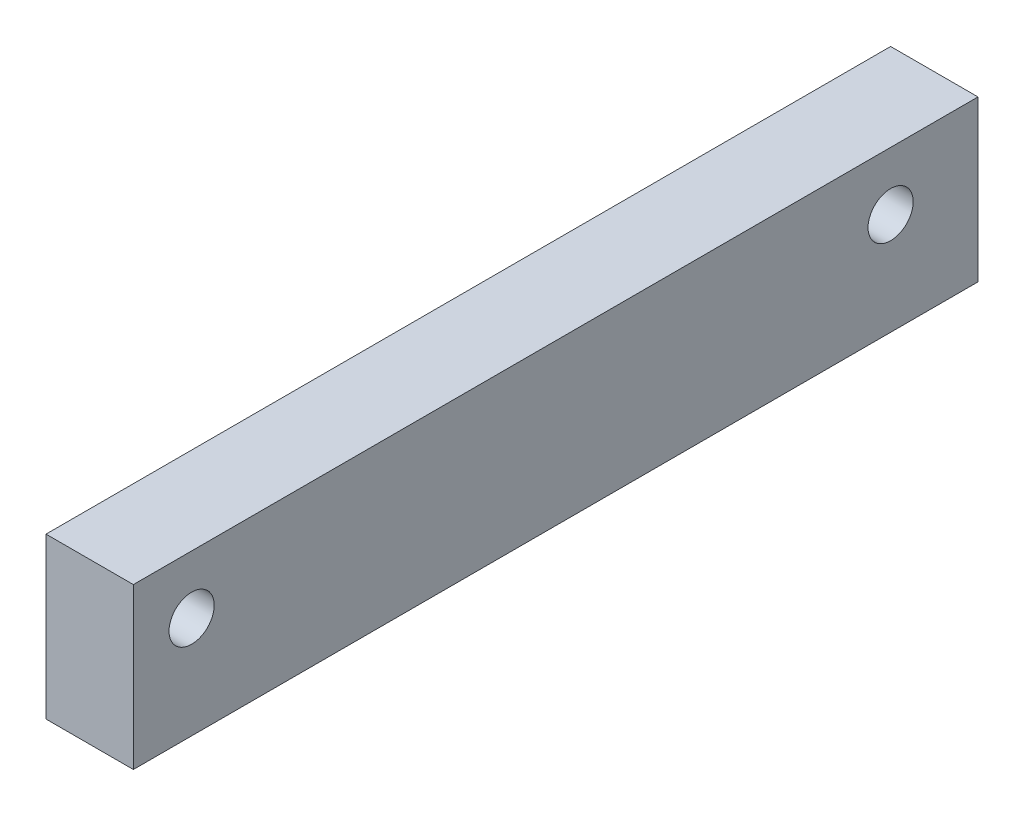
ISO-10303-21;
HEADER;
FILE_DESCRIPTION(('STEP AP214'),'2;1');
FILE_NAME('part.step','',(''),(''),'','','');
FILE_SCHEMA(('AUTOMOTIVE_DESIGN { 1 0 10303 214 1 1 1 1 }'));
ENDSEC;
DATA;
#1=APPLICATION_CONTEXT('core data for automotive mechanical design processes');
#2=APPLICATION_PROTOCOL_DEFINITION('international standard','automotive_design',2000,#1);
#3=PRODUCT_CONTEXT('',#1,'mechanical');
#4=PRODUCT('Part','Part','',(#3));
#5=PRODUCT_RELATED_PRODUCT_CATEGORY('part','',(#4));
#6=PRODUCT_DEFINITION_FORMATION('','',#4);
#7=PRODUCT_DEFINITION_CONTEXT('part definition',#1,'design');
#8=PRODUCT_DEFINITION('design','',#6,#7);
#9=PRODUCT_DEFINITION_SHAPE('','',#8);
#10=(LENGTH_UNIT() NAMED_UNIT(*) SI_UNIT(.MILLI.,.METRE.));
#11=(NAMED_UNIT(*) PLANE_ANGLE_UNIT() SI_UNIT($,.RADIAN.));
#12=(NAMED_UNIT(*) SI_UNIT($,.STERADIAN.) SOLID_ANGLE_UNIT());
#13=UNCERTAINTY_MEASURE_WITH_UNIT(LENGTH_MEASURE(1.E-05),#10,'distance_accuracy_value','');
#14=(GEOMETRIC_REPRESENTATION_CONTEXT(3) GLOBAL_UNCERTAINTY_ASSIGNED_CONTEXT((#13)) GLOBAL_UNIT_ASSIGNED_CONTEXT((#10,
#11,#12)) REPRESENTATION_CONTEXT('',''));
#15=CARTESIAN_POINT('',(0.,0.,0.));
#16=DIRECTION('',(0.,0.,1.));
#17=DIRECTION('',(1.,0.,0.));
#18=AXIS2_PLACEMENT_3D('',#15,#16,#17);
#19=CARTESIAN_POINT('',(-6.,0.,0.));
#20=DIRECTION('',(-1.,0.,0.));
#21=DIRECTION('',(0.,0.,1.));
#22=AXIS2_PLACEMENT_3D('',#19,#20,#21);
#23=PLANE('',#22);
#24=CARTESIAN_POINT('',(-6.,36.69227062005,-868.999999999998));
#25=DIRECTION('',(-1.,0.,0.));
#26=DIRECTION('',(0.,0.,1.));
#27=AXIS2_PLACEMENT_3D('',#24,#25,#26);
#28=CIRCLE('',#27,1.55);
#29=CARTESIAN_POINT('',(-6.,36.69227062005,-867.449999999998));
#30=VERTEX_POINT('',#29);
#31=EDGE_CURVE('E102',#30,#30,#28,.T.);
#32=ORIENTED_EDGE('',*,*,#31,.F.);
#33=EDGE_LOOP('',(#32));
#34=FACE_BOUND('',#33,.T.);
#35=DIRECTION('',(0.,0.,-1.));
#36=VECTOR('',#35,1.);
#37=CARTESIAN_POINT('',(-6.,40.69227062005,-816.999999999998));
#38=LINE('',#37,#36);
#39=CARTESIAN_POINT('',(-6.,40.69227062005,-816.999999999998));
#40=VERTEX_POINT('',#39);
#41=CARTESIAN_POINT('',(-6.,40.69227062005,-874.999999999998));
#42=VERTEX_POINT('',#41);
#43=EDGE_CURVE('E87',#40,#42,#38,.T.);
#44=ORIENTED_EDGE('',*,*,#43,.T.);
#45=DIRECTION('',(0.,-1.,0.));
#46=VECTOR('',#45,1.);
#47=CARTESIAN_POINT('',(-6.,40.69227062005,-874.999999999998));
#48=LINE('',#47,#46);
#49=CARTESIAN_POINT('',(-6.,29.69227062005,-874.999999999998));
#50=VERTEX_POINT('',#49);
#51=EDGE_CURVE('E82',#42,#50,#48,.T.);
#52=ORIENTED_EDGE('',*,*,#51,.T.);
#53=DIRECTION('',(0.,0.,1.));
#54=VECTOR('',#53,1.);
#55=CARTESIAN_POINT('',(-6.,29.69227062005,-874.999999999998));
#56=LINE('',#55,#54);
#57=CARTESIAN_POINT('',(-6.,29.69227062005,-816.999999999998));
#58=VERTEX_POINT('',#57);
#59=EDGE_CURVE('E85',#50,#58,#56,.T.);
#60=ORIENTED_EDGE('',*,*,#59,.T.);
#61=DIRECTION('',(0.,1.,0.));
#62=VECTOR('',#61,1.);
#63=CARTESIAN_POINT('',(-6.,29.69227062005,-816.999999999998));
#64=LINE('',#63,#62);
#65=EDGE_CURVE('E52',#58,#40,#64,.T.);
#66=ORIENTED_EDGE('',*,*,#65,.T.);
#67=EDGE_LOOP('',(#44,#52,#60,#66));
#68=FACE_BOUND('',#67,.T.);
#69=CARTESIAN_POINT('',(-6.,36.69227062005,-820.999999999998));
#70=DIRECTION('',(-1.,0.,0.));
#71=DIRECTION('',(0.,0.,1.));
#72=AXIS2_PLACEMENT_3D('',#69,#70,#71);
#73=CIRCLE('',#72,1.55);
#74=CARTESIAN_POINT('',(-6.,36.69227062005,-819.449999999998));
#75=VERTEX_POINT('',#74);
#76=EDGE_CURVE('E117',#75,#75,#73,.T.);
#77=ORIENTED_EDGE('',*,*,#76,.F.);
#78=EDGE_LOOP('',(#77));
#79=FACE_BOUND('',#78,.T.);
#80=ADVANCED_FACE('F35',(#34,#68,#79),#23,.T.);
#81=CARTESIAN_POINT('',(0.,0.,0.));
#82=DIRECTION('',(-1.,0.,0.));
#83=DIRECTION('',(0.,0.,1.));
#84=AXIS2_PLACEMENT_3D('',#81,#82,#83);
#85=PLANE('',#84);
#86=CARTESIAN_POINT('',(0.,36.69227062005,-868.999999999998));
#87=DIRECTION('',(-1.,0.,0.));
#88=DIRECTION('',(0.,0.,1.));
#89=AXIS2_PLACEMENT_3D('',#86,#87,#88);
#90=CIRCLE('',#89,1.55);
#91=CARTESIAN_POINT('',(0.,36.69227062005,-867.449999999998));
#92=VERTEX_POINT('',#91);
#93=EDGE_CURVE('E114',#92,#92,#90,.T.);
#94=ORIENTED_EDGE('',*,*,#93,.T.);
#95=EDGE_LOOP('',(#94));
#96=FACE_BOUND('',#95,.T.);
#97=DIRECTION('',(0.,0.,-1.));
#98=VECTOR('',#97,1.);
#99=CARTESIAN_POINT('',(0.,40.69227062005,-816.999999999998));
#100=LINE('',#99,#98);
#101=CARTESIAN_POINT('',(0.,40.69227062005,-816.999999999998));
#102=VERTEX_POINT('',#101);
#103=CARTESIAN_POINT('',(0.,40.69227062005,-874.999999999998));
#104=VERTEX_POINT('',#103);
#105=EDGE_CURVE('E99',#102,#104,#100,.T.);
#106=ORIENTED_EDGE('',*,*,#105,.F.);
#107=DIRECTION('',(0.,1.,0.));
#108=VECTOR('',#107,1.);
#109=CARTESIAN_POINT('',(0.,29.69227062005,-816.999999999998));
#110=LINE('',#109,#108);
#111=CARTESIAN_POINT('',(0.,29.69227062005,-816.999999999998));
#112=VERTEX_POINT('',#111);
#113=EDGE_CURVE('E75',#112,#102,#110,.T.);
#114=ORIENTED_EDGE('',*,*,#113,.F.);
#115=DIRECTION('',(0.,0.,1.));
#116=VECTOR('',#115,1.);
#117=CARTESIAN_POINT('',(0.,29.69227062005,-874.999999999998));
#118=LINE('',#117,#116);
#119=CARTESIAN_POINT('',(0.,29.69227062005,-874.999999999998));
#120=VERTEX_POINT('',#119);
#121=EDGE_CURVE('E69',#120,#112,#118,.T.);
#122=ORIENTED_EDGE('',*,*,#121,.F.);
#123=DIRECTION('',(0.,-1.,0.));
#124=VECTOR('',#123,1.);
#125=CARTESIAN_POINT('',(0.,40.69227062005,-874.999999999998));
#126=LINE('',#125,#124);
#127=EDGE_CURVE('E91',#104,#120,#126,.T.);
#128=ORIENTED_EDGE('',*,*,#127,.F.);
#129=EDGE_LOOP('',(#106,#114,#122,#128));
#130=FACE_BOUND('',#129,.T.);
#131=CARTESIAN_POINT('',(0.,36.69227062005,-820.999999999998));
#132=DIRECTION('',(-1.,0.,0.));
#133=DIRECTION('',(0.,0.,1.));
#134=AXIS2_PLACEMENT_3D('',#131,#132,#133);
#135=CIRCLE('',#134,1.55);
#136=CARTESIAN_POINT('',(0.,36.69227062005,-819.449999999998));
#137=VERTEX_POINT('',#136);
#138=EDGE_CURVE('E120',#137,#137,#135,.T.);
#139=ORIENTED_EDGE('',*,*,#138,.T.);
#140=EDGE_LOOP('',(#139));
#141=FACE_BOUND('',#140,.T.);
#142=ADVANCED_FACE('F110',(#96,#130,#141),#85,.F.);
#143=CARTESIAN_POINT('',(-6.,40.69227062005,-816.999999999998));
#144=DIRECTION('',(0.,-1.,0.));
#145=DIRECTION('',(0.,0.,-1.));
#146=AXIS2_PLACEMENT_3D('',#143,#144,#145);
#147=PLANE('',#146);
#148=ORIENTED_EDGE('',*,*,#105,.T.);
#149=DIRECTION('',(1.,0.,0.));
#150=VECTOR('',#149,1.);
#151=CARTESIAN_POINT('',(-6.,40.69227062005,-874.999999999998));
#152=LINE('',#151,#150);
#153=EDGE_CURVE('E11',#42,#104,#152,.T.);
#154=ORIENTED_EDGE('',*,*,#153,.F.);
#155=ORIENTED_EDGE('',*,*,#43,.F.);
#156=DIRECTION('',(1.,0.,0.));
#157=VECTOR('',#156,1.);
#158=CARTESIAN_POINT('',(-6.,40.69227062005,-816.999999999998));
#159=LINE('',#158,#157);
#160=EDGE_CURVE('E95',#40,#102,#159,.T.);
#161=ORIENTED_EDGE('',*,*,#160,.T.);
#162=EDGE_LOOP('',(#148,#154,#155,#161));
#163=FACE_BOUND('',#162,.T.);
#164=ADVANCED_FACE('F37',(#163),#147,.F.);
#165=CARTESIAN_POINT('',(-6.,40.69227062005,-874.999999999998));
#166=DIRECTION('',(0.,0.,1.));
#167=DIRECTION('',(1.,0.,0.));
#168=AXIS2_PLACEMENT_3D('',#165,#166,#167);
#169=PLANE('',#168);
#170=ORIENTED_EDGE('',*,*,#127,.T.);
#171=DIRECTION('',(1.,0.,0.));
#172=VECTOR('',#171,1.);
#173=CARTESIAN_POINT('',(-6.,29.69227062005,-874.999999999998));
#174=LINE('',#173,#172);
#175=EDGE_CURVE('E44',#50,#120,#174,.T.);
#176=ORIENTED_EDGE('',*,*,#175,.F.);
#177=ORIENTED_EDGE('',*,*,#51,.F.);
#178=ORIENTED_EDGE('',*,*,#153,.T.);
#179=EDGE_LOOP('',(#170,#176,#177,#178));
#180=FACE_BOUND('',#179,.T.);
#181=ADVANCED_FACE('F90',(#180),#169,.F.);
#182=CARTESIAN_POINT('',(-6.,29.69227062005,-874.999999999998));
#183=DIRECTION('',(0.,1.,0.));
#184=DIRECTION('',(0.,0.,1.));
#185=AXIS2_PLACEMENT_3D('',#182,#183,#184);
#186=PLANE('',#185);
#187=ORIENTED_EDGE('',*,*,#121,.T.);
#188=DIRECTION('',(1.,0.,0.));
#189=VECTOR('',#188,1.);
#190=CARTESIAN_POINT('',(-6.,29.69227062005,-816.999999999998));
#191=LINE('',#190,#189);
#192=EDGE_CURVE('E92',#58,#112,#191,.T.);
#193=ORIENTED_EDGE('',*,*,#192,.F.);
#194=ORIENTED_EDGE('',*,*,#59,.F.);
#195=ORIENTED_EDGE('',*,*,#175,.T.);
#196=EDGE_LOOP('',(#187,#193,#194,#195));
#197=FACE_BOUND('',#196,.T.);
#198=ADVANCED_FACE('F93',(#197),#186,.F.);
#199=CARTESIAN_POINT('',(-6.,29.69227062005,-816.999999999998));
#200=DIRECTION('',(0.,0.,-1.));
#201=DIRECTION('',(-1.,0.,0.));
#202=AXIS2_PLACEMENT_3D('',#199,#200,#201);
#203=PLANE('',#202);
#204=ORIENTED_EDGE('',*,*,#113,.T.);
#205=ORIENTED_EDGE('',*,*,#160,.F.);
#206=ORIENTED_EDGE('',*,*,#65,.F.);
#207=ORIENTED_EDGE('',*,*,#192,.T.);
#208=EDGE_LOOP('',(#204,#205,#206,#207));
#209=FACE_BOUND('',#208,.T.);
#210=ADVANCED_FACE('F107',(#209),#203,.F.);
#211=CARTESIAN_POINT('',(-6.,36.69227062005,-868.999999999998));
#212=DIRECTION('',(1.,0.,0.));
#213=DIRECTION('',(0.,0.,-1.));
#214=AXIS2_PLACEMENT_3D('',#211,#212,#213);
#215=CYLINDRICAL_SURFACE('',#214,1.55);
#216=ORIENTED_EDGE('',*,*,#31,.T.);
#217=EDGE_LOOP('',(#216));
#218=FACE_BOUND('',#217,.T.);
#219=ORIENTED_EDGE('',*,*,#93,.F.);
#220=EDGE_LOOP('',(#219));
#221=FACE_BOUND('',#220,.T.);
#222=ADVANCED_FACE('F138',(#218,#221),#215,.F.);
#223=CARTESIAN_POINT('',(-6.,36.69227062005,-820.999999999998));
#224=DIRECTION('',(1.,0.,0.));
#225=DIRECTION('',(0.,0.,-1.));
#226=AXIS2_PLACEMENT_3D('',#223,#224,#225);
#227=CYLINDRICAL_SURFACE('',#226,1.55);
#228=ORIENTED_EDGE('',*,*,#76,.T.);
#229=EDGE_LOOP('',(#228));
#230=FACE_BOUND('',#229,.T.);
#231=ORIENTED_EDGE('',*,*,#138,.F.);
#232=EDGE_LOOP('',(#231));
#233=FACE_BOUND('',#232,.T.);
#234=ADVANCED_FACE('F126',(#230,#233),#227,.F.);
#235=CLOSED_SHELL('',(#80,#142,#164,#181,#198,#210,#222,#234));
#236=MANIFOLD_SOLID_BREP('B2',#235);
#237=ADVANCED_BREP_SHAPE_REPRESENTATION('',(#18,#236),#14);
#238=SHAPE_DEFINITION_REPRESENTATION(#9,#237);
ENDSEC;
END-ISO-10303-21;
